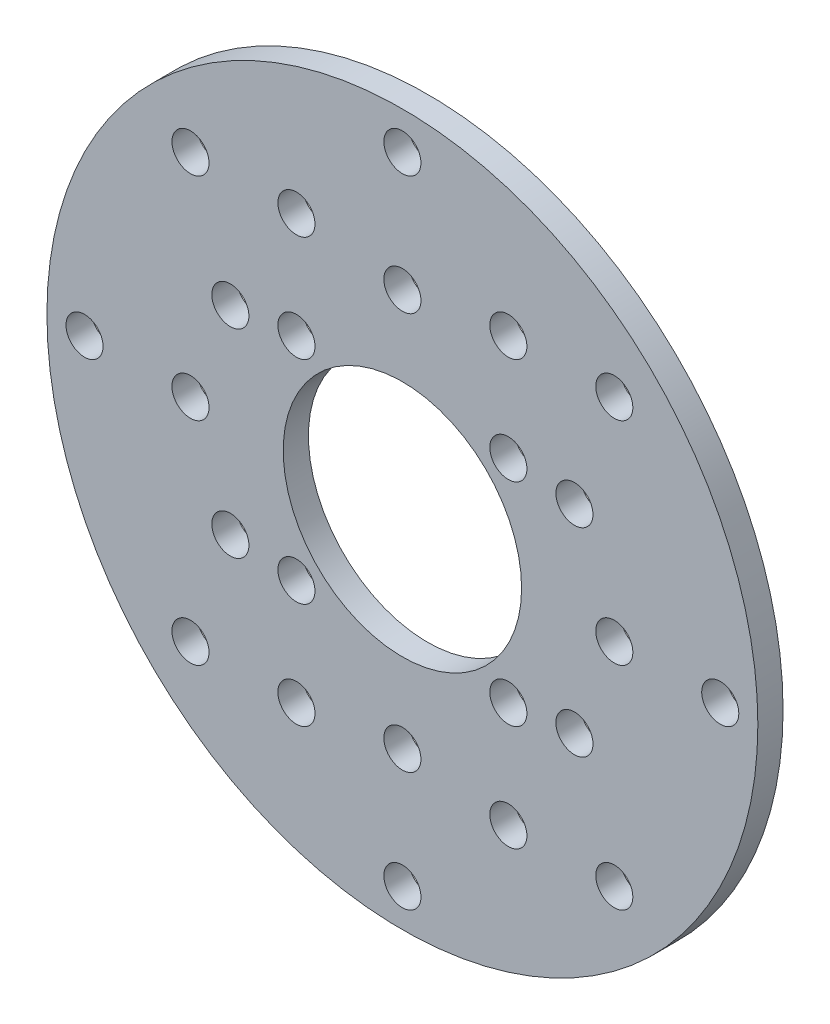
ISO-10303-21;
HEADER;
FILE_DESCRIPTION(('STEP AP214'),'2;1');
FILE_NAME('part.step','',(''),(''),'','','');
FILE_SCHEMA(('AUTOMOTIVE_DESIGN { 1 0 10303 214 1 1 1 1 }'));
ENDSEC;
DATA;
#1=APPLICATION_CONTEXT('core data for automotive mechanical design processes');
#2=APPLICATION_PROTOCOL_DEFINITION('international standard','automotive_design',2000,#1);
#3=PRODUCT_CONTEXT('',#1,'mechanical');
#4=PRODUCT('Part','Part','',(#3));
#5=PRODUCT_RELATED_PRODUCT_CATEGORY('part','',(#4));
#6=PRODUCT_DEFINITION_FORMATION('','',#4);
#7=PRODUCT_DEFINITION_CONTEXT('part definition',#1,'design');
#8=PRODUCT_DEFINITION('design','',#6,#7);
#9=PRODUCT_DEFINITION_SHAPE('','',#8);
#10=(LENGTH_UNIT() NAMED_UNIT(*) SI_UNIT(.MILLI.,.METRE.));
#11=(NAMED_UNIT(*) PLANE_ANGLE_UNIT() SI_UNIT($,.RADIAN.));
#12=(NAMED_UNIT(*) SI_UNIT($,.STERADIAN.) SOLID_ANGLE_UNIT());
#13=UNCERTAINTY_MEASURE_WITH_UNIT(LENGTH_MEASURE(1.E-05),#10,'distance_accuracy_value','');
#14=(GEOMETRIC_REPRESENTATION_CONTEXT(3) GLOBAL_UNCERTAINTY_ASSIGNED_CONTEXT((#13)) GLOBAL_UNIT_ASSIGNED_CONTEXT((#10,
#11,#12)) REPRESENTATION_CONTEXT('',''));
#15=CARTESIAN_POINT('',(0.,0.,0.));
#16=DIRECTION('',(0.,0.,1.));
#17=DIRECTION('',(1.,0.,0.));
#18=AXIS2_PLACEMENT_3D('',#15,#16,#17);
#19=CARTESIAN_POINT('',(0.,0.,-1.5113));
#20=DIRECTION('',(0.,0.,1.));
#21=DIRECTION('',(1.,0.,0.));
#22=AXIS2_PLACEMENT_3D('',#19,#20,#21);
#23=PLANE('',#22);
#24=CARTESIAN_POINT('',(-20.6222299276168,11.9062500000001,-1.5113));
#25=DIRECTION('',(0.,0.,-1.));
#26=DIRECTION('',(1.,0.,0.));
#27=AXIS2_PLACEMENT_3D('',#24,#25,#26);
#28=CIRCLE('',#27,2.2225);
#29=CARTESIAN_POINT('',(-18.3997299276168,11.9062500000001,-1.5113));
#30=VERTEX_POINT('',#29);
#31=EDGE_CURVE('E19',#30,#30,#28,.T.);
#32=ORIENTED_EDGE('',*,*,#31,.F.);
#33=EDGE_LOOP('',(#32));
#34=FACE_BOUND('',#33,.T.);
#35=CARTESIAN_POINT('',(1.69197988952874E-13,23.8125,-1.5113));
#36=DIRECTION('',(0.,0.,1.));
#37=DIRECTION('',(1.,0.,0.));
#38=AXIS2_PLACEMENT_3D('',#35,#36,#37);
#39=CIRCLE('',#38,2.22250000000016);
#40=CARTESIAN_POINT('',(2.22250000000033,23.8125,-1.5113));
#41=VERTEX_POINT('',#40);
#42=EDGE_CURVE('E187',#41,#41,#39,.T.);
#43=ORIENTED_EDGE('',*,*,#42,.T.);
#44=EDGE_LOOP('',(#43));
#45=FACE_BOUND('',#44,.T.);
#46=CARTESIAN_POINT('',(20.6222299276168,11.9062500000002,-1.5113));
#47=DIRECTION('',(0.,0.,1.));
#48=DIRECTION('',(1.,0.,0.));
#49=AXIS2_PLACEMENT_3D('',#46,#47,#48);
#50=CIRCLE('',#49,2.2225);
#51=CARTESIAN_POINT('',(22.8447299276168,11.9062500000002,-1.5113));
#52=VERTEX_POINT('',#51);
#53=EDGE_CURVE('E157',#52,#52,#50,.T.);
#54=ORIENTED_EDGE('',*,*,#53,.T.);
#55=EDGE_LOOP('',(#54));
#56=FACE_BOUND('',#55,.T.);
#57=CARTESIAN_POINT('',(0.,0.,-1.5113));
#58=DIRECTION('',(0.,0.,1.));
#59=DIRECTION('',(1.,0.,0.));
#60=AXIS2_PLACEMENT_3D('',#57,#58,#59);
#61=CIRCLE('',#60,14.2875);
#62=CARTESIAN_POINT('',(14.2875,0.,-1.5113));
#63=VERTEX_POINT('',#62);
#64=EDGE_CURVE('E156',#63,#63,#61,.T.);
#65=ORIENTED_EDGE('',*,*,#64,.T.);
#66=EDGE_LOOP('',(#65));
#67=FACE_BOUND('',#66,.T.);
#68=CARTESIAN_POINT('',(20.6222299276168,-11.9062500000001,-1.5113));
#69=DIRECTION('',(0.,0.,-1.));
#70=DIRECTION('',(1.,0.,0.));
#71=AXIS2_PLACEMENT_3D('',#68,#69,#70);
#72=CIRCLE('',#71,2.2225);
#73=CARTESIAN_POINT('',(22.8447299276169,-11.9062500000001,-1.5113));
#74=VERTEX_POINT('',#73);
#75=EDGE_CURVE('E158',#74,#74,#72,.T.);
#76=ORIENTED_EDGE('',*,*,#75,.F.);
#77=EDGE_LOOP('',(#76));
#78=FACE_BOUND('',#77,.T.);
#79=CARTESIAN_POINT('',(2.09313469334837E-13,-23.8125,-1.5113));
#80=DIRECTION('',(0.,0.,1.));
#81=DIRECTION('',(1.,0.,0.));
#82=AXIS2_PLACEMENT_3D('',#79,#80,#81);
#83=CIRCLE('',#82,2.2225);
#84=CARTESIAN_POINT('',(2.2225000000002,-23.8125,-1.5113));
#85=VERTEX_POINT('',#84);
#86=EDGE_CURVE('E226',#85,#85,#83,.T.);
#87=ORIENTED_EDGE('',*,*,#86,.T.);
#88=EDGE_LOOP('',(#87));
#89=FACE_BOUND('',#88,.T.);
#90=CARTESIAN_POINT('',(38.1,0.,-1.5113));
#91=DIRECTION('',(0.,0.,1.));
#92=DIRECTION('',(1.,0.,0.));
#93=AXIS2_PLACEMENT_3D('',#90,#91,#92);
#94=CIRCLE('',#93,2.2225);
#95=CARTESIAN_POINT('',(40.3225,0.,-1.5113));
#96=VERTEX_POINT('',#95);
#97=EDGE_CURVE('E180',#96,#96,#94,.T.);
#98=ORIENTED_EDGE('',*,*,#97,.T.);
#99=EDGE_LOOP('',(#98));
#100=FACE_BOUND('',#99,.T.);
#101=CARTESIAN_POINT('',(25.4,25.4,-1.5113));
#102=DIRECTION('',(0.,0.,1.));
#103=DIRECTION('',(1.,0.,0.));
#104=AXIS2_PLACEMENT_3D('',#101,#102,#103);
#105=CIRCLE('',#104,2.2225);
#106=CARTESIAN_POINT('',(27.6225,25.4,-1.5113));
#107=VERTEX_POINT('',#106);
#108=EDGE_CURVE('E179',#107,#107,#105,.T.);
#109=ORIENTED_EDGE('',*,*,#108,.T.);
#110=EDGE_LOOP('',(#109));
#111=FACE_BOUND('',#110,.T.);
#112=CARTESIAN_POINT('',(-25.4,0.,-1.5113));
#113=DIRECTION('',(0.,0.,1.));
#114=DIRECTION('',(1.,0.,0.));
#115=AXIS2_PLACEMENT_3D('',#112,#113,#114);
#116=CIRCLE('',#115,2.2225);
#117=CARTESIAN_POINT('',(-23.1775,0.,-1.5113));
#118=VERTEX_POINT('',#117);
#119=EDGE_CURVE('E174',#118,#118,#116,.T.);
#120=ORIENTED_EDGE('',*,*,#119,.T.);
#121=EDGE_LOOP('',(#120));
#122=FACE_BOUND('',#121,.T.);
#123=CARTESIAN_POINT('',(-38.1,-1.79105159992208E-13,-1.5113));
#124=DIRECTION('',(0.,0.,1.));
#125=DIRECTION('',(1.,0.,0.));
#126=AXIS2_PLACEMENT_3D('',#123,#124,#125);
#127=CIRCLE('',#126,2.2225);
#128=CARTESIAN_POINT('',(-35.8775,-1.79105159992208E-13,-1.5113));
#129=VERTEX_POINT('',#128);
#130=EDGE_CURVE('E173',#129,#129,#127,.T.);
#131=ORIENTED_EDGE('',*,*,#130,.T.);
#132=EDGE_LOOP('',(#131));
#133=FACE_BOUND('',#132,.T.);
#134=CARTESIAN_POINT('',(0.,38.1,-1.5113));
#135=DIRECTION('',(0.,0.,1.));
#136=DIRECTION('',(1.,0.,0.));
#137=AXIS2_PLACEMENT_3D('',#134,#135,#136);
#138=CIRCLE('',#137,2.2225);
#139=CARTESIAN_POINT('',(2.2225,38.1,-1.5113));
#140=VERTEX_POINT('',#139);
#141=EDGE_CURVE('E143',#140,#140,#138,.T.);
#142=ORIENTED_EDGE('',*,*,#141,.T.);
#143=EDGE_LOOP('',(#142));
#144=FACE_BOUND('',#143,.T.);
#145=CARTESIAN_POINT('',(-25.4,25.4,-1.5113));
#146=DIRECTION('',(0.,0.,1.));
#147=DIRECTION('',(1.,0.,0.));
#148=AXIS2_PLACEMENT_3D('',#145,#146,#147);
#149=CIRCLE('',#148,2.2225);
#150=CARTESIAN_POINT('',(-23.1775,25.4,-1.5113));
#151=VERTEX_POINT('',#150);
#152=EDGE_CURVE('E152',#151,#151,#149,.T.);
#153=ORIENTED_EDGE('',*,*,#152,.T.);
#154=EDGE_LOOP('',(#153));
#155=FACE_BOUND('',#154,.T.);
#156=CARTESIAN_POINT('',(12.7,12.7,-1.5113));
#157=DIRECTION('',(0.,0.,1.));
#158=DIRECTION('',(1.,0.,0.));
#159=AXIS2_PLACEMENT_3D('',#156,#157,#158);
#160=CIRCLE('',#159,2.2225);
#161=CARTESIAN_POINT('',(14.9225,12.7,-1.5113));
#162=VERTEX_POINT('',#161);
#163=EDGE_CURVE('E269',#162,#162,#160,.T.);
#164=ORIENTED_EDGE('',*,*,#163,.T.);
#165=EDGE_LOOP('',(#164));
#166=FACE_BOUND('',#165,.T.);
#167=CARTESIAN_POINT('',(12.7,25.4,-1.5113));
#168=DIRECTION('',(0.,0.,1.));
#169=DIRECTION('',(1.,0.,0.));
#170=AXIS2_PLACEMENT_3D('',#167,#168,#169);
#171=CIRCLE('',#170,2.2225);
#172=CARTESIAN_POINT('',(14.9225,25.4,-1.5113));
#173=VERTEX_POINT('',#172);
#174=EDGE_CURVE('E128',#173,#173,#171,.T.);
#175=ORIENTED_EDGE('',*,*,#174,.T.);
#176=EDGE_LOOP('',(#175));
#177=FACE_BOUND('',#176,.T.);
#178=CARTESIAN_POINT('',(25.4,-25.4,-1.5113));
#179=DIRECTION('',(0.,0.,1.));
#180=DIRECTION('',(1.,0.,0.));
#181=AXIS2_PLACEMENT_3D('',#178,#179,#180);
#182=CIRCLE('',#181,2.2225);
#183=CARTESIAN_POINT('',(27.6225,-25.4,-1.5113));
#184=VERTEX_POINT('',#183);
#185=EDGE_CURVE('E113',#184,#184,#182,.T.);
#186=ORIENTED_EDGE('',*,*,#185,.T.);
#187=EDGE_LOOP('',(#186));
#188=FACE_BOUND('',#187,.T.);
#189=CARTESIAN_POINT('',(-12.7,12.7,-1.5113));
#190=DIRECTION('',(0.,0.,1.));
#191=DIRECTION('',(1.,0.,0.));
#192=AXIS2_PLACEMENT_3D('',#189,#190,#191);
#193=CIRCLE('',#192,2.2225);
#194=CARTESIAN_POINT('',(-10.4775,12.7,-1.5113));
#195=VERTEX_POINT('',#194);
#196=EDGE_CURVE('E125',#195,#195,#193,.T.);
#197=ORIENTED_EDGE('',*,*,#196,.T.);
#198=EDGE_LOOP('',(#197));
#199=FACE_BOUND('',#198,.T.);
#200=CARTESIAN_POINT('',(-12.7,25.4,-1.5113));
#201=DIRECTION('',(0.,0.,1.));
#202=DIRECTION('',(1.,0.,0.));
#203=AXIS2_PLACEMENT_3D('',#200,#201,#202);
#204=CIRCLE('',#203,2.2225);
#205=CARTESIAN_POINT('',(-10.4775,25.4,-1.5113));
#206=VERTEX_POINT('',#205);
#207=EDGE_CURVE('E186',#206,#206,#204,.T.);
#208=ORIENTED_EDGE('',*,*,#207,.T.);
#209=EDGE_LOOP('',(#208));
#210=FACE_BOUND('',#209,.T.);
#211=CARTESIAN_POINT('',(12.7,-25.4,-1.5113));
#212=DIRECTION('',(0.,0.,1.));
#213=DIRECTION('',(1.,0.,0.));
#214=AXIS2_PLACEMENT_3D('',#211,#212,#213);
#215=CIRCLE('',#214,2.2225);
#216=CARTESIAN_POINT('',(14.9225,-25.4,-1.5113));
#217=VERTEX_POINT('',#216);
#218=EDGE_CURVE('E185',#217,#217,#215,.T.);
#219=ORIENTED_EDGE('',*,*,#218,.T.);
#220=EDGE_LOOP('',(#219));
#221=FACE_BOUND('',#220,.T.);
#222=CARTESIAN_POINT('',(12.7,-12.7,-1.5113));
#223=DIRECTION('',(0.,0.,1.));
#224=DIRECTION('',(1.,0.,0.));
#225=AXIS2_PLACEMENT_3D('',#222,#223,#224);
#226=CIRCLE('',#225,2.2225);
#227=CARTESIAN_POINT('',(14.9225,-12.7,-1.5113));
#228=VERTEX_POINT('',#227);
#229=EDGE_CURVE('E243',#228,#228,#226,.T.);
#230=ORIENTED_EDGE('',*,*,#229,.T.);
#231=EDGE_LOOP('',(#230));
#232=FACE_BOUND('',#231,.T.);
#233=CARTESIAN_POINT('',(25.4,0.,-1.5113));
#234=DIRECTION('',(0.,0.,1.));
#235=DIRECTION('',(1.,0.,0.));
#236=AXIS2_PLACEMENT_3D('',#233,#234,#235);
#237=CIRCLE('',#236,2.2225);
#238=CARTESIAN_POINT('',(27.6225,0.,-1.5113));
#239=VERTEX_POINT('',#238);
#240=EDGE_CURVE('E202',#239,#239,#237,.T.);
#241=ORIENTED_EDGE('',*,*,#240,.T.);
#242=EDGE_LOOP('',(#241));
#243=FACE_BOUND('',#242,.T.);
#244=CARTESIAN_POINT('',(0.,-38.1,-1.5113));
#245=DIRECTION('',(0.,0.,1.));
#246=DIRECTION('',(1.,0.,0.));
#247=AXIS2_PLACEMENT_3D('',#244,#245,#246);
#248=CIRCLE('',#247,2.2225);
#249=CARTESIAN_POINT('',(2.2225,-38.1,-1.5113));
#250=VERTEX_POINT('',#249);
#251=EDGE_CURVE('E138',#250,#250,#248,.T.);
#252=ORIENTED_EDGE('',*,*,#251,.T.);
#253=EDGE_LOOP('',(#252));
#254=FACE_BOUND('',#253,.T.);
#255=CARTESIAN_POINT('',(-12.7,-12.7,-1.5113));
#256=DIRECTION('',(0.,0.,1.));
#257=DIRECTION('',(1.,0.,0.));
#258=AXIS2_PLACEMENT_3D('',#255,#256,#257);
#259=CIRCLE('',#258,2.2225);
#260=CARTESIAN_POINT('',(-10.4775,-12.7,-1.5113));
#261=VERTEX_POINT('',#260);
#262=EDGE_CURVE('E137',#261,#261,#259,.T.);
#263=ORIENTED_EDGE('',*,*,#262,.T.);
#264=EDGE_LOOP('',(#263));
#265=FACE_BOUND('',#264,.T.);
#266=CARTESIAN_POINT('',(-12.7,-25.4,-1.5113));
#267=DIRECTION('',(0.,0.,1.));
#268=DIRECTION('',(1.,0.,0.));
#269=AXIS2_PLACEMENT_3D('',#266,#267,#268);
#270=CIRCLE('',#269,2.2225);
#271=CARTESIAN_POINT('',(-10.4775,-25.4,-1.5113));
#272=VERTEX_POINT('',#271);
#273=EDGE_CURVE('E249',#272,#272,#270,.T.);
#274=ORIENTED_EDGE('',*,*,#273,.T.);
#275=EDGE_LOOP('',(#274));
#276=FACE_BOUND('',#275,.T.);
#277=CARTESIAN_POINT('',(-25.4,-25.4,-1.5113));
#278=DIRECTION('',(0.,0.,1.));
#279=DIRECTION('',(1.,0.,0.));
#280=AXIS2_PLACEMENT_3D('',#277,#278,#279);
#281=CIRCLE('',#280,2.2225);
#282=CARTESIAN_POINT('',(-23.1775,-25.4,-1.5113));
#283=VERTEX_POINT('',#282);
#284=EDGE_CURVE('E254',#283,#283,#281,.T.);
#285=ORIENTED_EDGE('',*,*,#284,.T.);
#286=EDGE_LOOP('',(#285));
#287=FACE_BOUND('',#286,.T.);
#288=CARTESIAN_POINT('',(-20.6222299276168,-11.9062500000001,-1.5113));
#289=DIRECTION('',(0.,0.,1.));
#290=DIRECTION('',(1.,0.,0.));
#291=AXIS2_PLACEMENT_3D('',#288,#289,#290);
#292=CIRCLE('',#291,2.2225);
#293=CARTESIAN_POINT('',(-18.3997299276168,-11.9062500000001,-1.5113));
#294=VERTEX_POINT('',#293);
#295=EDGE_CURVE('E164',#294,#294,#292,.T.);
#296=ORIENTED_EDGE('',*,*,#295,.T.);
#297=EDGE_LOOP('',(#296));
#298=FACE_BOUND('',#297,.T.);
#299=CARTESIAN_POINT('',(0.,0.,-1.5113));
#300=DIRECTION('',(0.,0.,1.));
#301=DIRECTION('',(1.,0.,0.));
#302=AXIS2_PLACEMENT_3D('',#299,#300,#301);
#303=CIRCLE('',#302,42.6085);
#304=CARTESIAN_POINT('',(42.6085,0.,-1.5113));
#305=VERTEX_POINT('',#304);
#306=EDGE_CURVE('E207',#305,#305,#303,.T.);
#307=ORIENTED_EDGE('',*,*,#306,.F.);
#308=EDGE_LOOP('',(#307));
#309=FACE_BOUND('',#308,.T.);
#310=ADVANCED_FACE('F15',(#34,#45,#56,#67,#78,#89,#100,#111,#122,#133,#144,#155,#166,#177,#188,
#199,#210,#221,#232,#243,#254,#265,#276,#287,#298,#309),#23,.F.);
#311=CARTESIAN_POINT('',(0.,0.,1.5113));
#312=DIRECTION('',(0.,0.,1.));
#313=DIRECTION('',(1.,0.,0.));
#314=AXIS2_PLACEMENT_3D('',#311,#312,#313);
#315=PLANE('',#314);
#316=CARTESIAN_POINT('',(-20.6222299276168,11.9062500000001,1.5113));
#317=DIRECTION('',(0.,0.,-1.));
#318=DIRECTION('',(1.,0.,0.));
#319=AXIS2_PLACEMENT_3D('',#316,#317,#318);
#320=CIRCLE('',#319,2.2225);
#321=CARTESIAN_POINT('',(-18.3997299276168,11.9062500000001,1.5113));
#322=VERTEX_POINT('',#321);
#323=EDGE_CURVE('E10',#322,#322,#320,.T.);
#324=ORIENTED_EDGE('',*,*,#323,.T.);
#325=EDGE_LOOP('',(#324));
#326=FACE_BOUND('',#325,.T.);
#327=CARTESIAN_POINT('',(1.69197988952874E-13,23.8125,1.5113));
#328=DIRECTION('',(0.,0.,1.));
#329=DIRECTION('',(1.,0.,0.));
#330=AXIS2_PLACEMENT_3D('',#327,#328,#329);
#331=CIRCLE('',#330,2.22250000000016);
#332=CARTESIAN_POINT('',(2.22250000000033,23.8125,1.5113));
#333=VERTEX_POINT('',#332);
#334=EDGE_CURVE('E191',#333,#333,#331,.T.);
#335=ORIENTED_EDGE('',*,*,#334,.F.);
#336=EDGE_LOOP('',(#335));
#337=FACE_BOUND('',#336,.T.);
#338=CARTESIAN_POINT('',(20.6222299276168,11.9062500000002,1.5113));
#339=DIRECTION('',(0.,0.,1.));
#340=DIRECTION('',(1.,0.,0.));
#341=AXIS2_PLACEMENT_3D('',#338,#339,#340);
#342=CIRCLE('',#341,2.2225);
#343=CARTESIAN_POINT('',(22.8447299276168,11.9062500000002,1.5113));
#344=VERTEX_POINT('',#343);
#345=EDGE_CURVE('E153',#344,#344,#342,.T.);
#346=ORIENTED_EDGE('',*,*,#345,.F.);
#347=EDGE_LOOP('',(#346));
#348=FACE_BOUND('',#347,.T.);
#349=CARTESIAN_POINT('',(0.,0.,1.5113));
#350=DIRECTION('',(0.,0.,1.));
#351=DIRECTION('',(1.,0.,0.));
#352=AXIS2_PLACEMENT_3D('',#349,#350,#351);
#353=CIRCLE('',#352,14.2875);
#354=CARTESIAN_POINT('',(14.2875,0.,1.5113));
#355=VERTEX_POINT('',#354);
#356=EDGE_CURVE('E163',#355,#355,#353,.T.);
#357=ORIENTED_EDGE('',*,*,#356,.F.);
#358=EDGE_LOOP('',(#357));
#359=FACE_BOUND('',#358,.T.);
#360=CARTESIAN_POINT('',(20.6222299276168,-11.9062500000001,1.5113));
#361=DIRECTION('',(0.,0.,-1.));
#362=DIRECTION('',(1.,0.,0.));
#363=AXIS2_PLACEMENT_3D('',#360,#361,#362);
#364=CIRCLE('',#363,2.2225);
#365=CARTESIAN_POINT('',(22.8447299276169,-11.9062500000001,1.5113));
#366=VERTEX_POINT('',#365);
#367=EDGE_CURVE('E162',#366,#366,#364,.T.);
#368=ORIENTED_EDGE('',*,*,#367,.T.);
#369=EDGE_LOOP('',(#368));
#370=FACE_BOUND('',#369,.T.);
#371=CARTESIAN_POINT('',(2.09313469334837E-13,-23.8125,1.5113));
#372=DIRECTION('',(0.,0.,1.));
#373=DIRECTION('',(1.,0.,0.));
#374=AXIS2_PLACEMENT_3D('',#371,#372,#373);
#375=CIRCLE('',#374,2.2225);
#376=CARTESIAN_POINT('',(2.2225000000002,-23.8125,1.5113));
#377=VERTEX_POINT('',#376);
#378=EDGE_CURVE('E219',#377,#377,#375,.T.);
#379=ORIENTED_EDGE('',*,*,#378,.F.);
#380=EDGE_LOOP('',(#379));
#381=FACE_BOUND('',#380,.T.);
#382=CARTESIAN_POINT('',(38.1,0.,1.5113));
#383=DIRECTION('',(0.,0.,1.));
#384=DIRECTION('',(1.,0.,0.));
#385=AXIS2_PLACEMENT_3D('',#382,#383,#384);
#386=CIRCLE('',#385,2.2225);
#387=CARTESIAN_POINT('',(40.3225,0.,1.5113));
#388=VERTEX_POINT('',#387);
#389=EDGE_CURVE('E175',#388,#388,#386,.T.);
#390=ORIENTED_EDGE('',*,*,#389,.F.);
#391=EDGE_LOOP('',(#390));
#392=FACE_BOUND('',#391,.T.);
#393=CARTESIAN_POINT('',(25.4,25.4,1.5113));
#394=DIRECTION('',(0.,0.,1.));
#395=DIRECTION('',(1.,0.,0.));
#396=AXIS2_PLACEMENT_3D('',#393,#394,#395);
#397=CIRCLE('',#396,2.2225);
#398=CARTESIAN_POINT('',(27.6225,25.4,1.5113));
#399=VERTEX_POINT('',#398);
#400=EDGE_CURVE('E132',#399,#399,#397,.T.);
#401=ORIENTED_EDGE('',*,*,#400,.F.);
#402=EDGE_LOOP('',(#401));
#403=FACE_BOUND('',#402,.T.);
#404=CARTESIAN_POINT('',(-25.4,0.,1.5113));
#405=DIRECTION('',(0.,0.,1.));
#406=DIRECTION('',(1.,0.,0.));
#407=AXIS2_PLACEMENT_3D('',#404,#405,#406);
#408=CIRCLE('',#407,2.2225);
#409=CARTESIAN_POINT('',(-23.1775,0.,1.5113));
#410=VERTEX_POINT('',#409);
#411=EDGE_CURVE('E169',#410,#410,#408,.T.);
#412=ORIENTED_EDGE('',*,*,#411,.F.);
#413=EDGE_LOOP('',(#412));
#414=FACE_BOUND('',#413,.T.);
#415=CARTESIAN_POINT('',(-38.1,-1.79105159992208E-13,1.5113));
#416=DIRECTION('',(0.,0.,1.));
#417=DIRECTION('',(1.,0.,0.));
#418=AXIS2_PLACEMENT_3D('',#415,#416,#417);
#419=CIRCLE('',#418,2.2225);
#420=CARTESIAN_POINT('',(-35.8775,-1.79105159992208E-13,1.5113));
#421=VERTEX_POINT('',#420);
#422=EDGE_CURVE('E148',#421,#421,#419,.T.);
#423=ORIENTED_EDGE('',*,*,#422,.F.);
#424=EDGE_LOOP('',(#423));
#425=FACE_BOUND('',#424,.T.);
#426=CARTESIAN_POINT('',(0.,38.1,1.5113));
#427=DIRECTION('',(0.,0.,1.));
#428=DIRECTION('',(1.,0.,0.));
#429=AXIS2_PLACEMENT_3D('',#426,#427,#428);
#430=CIRCLE('',#429,2.2225);
#431=CARTESIAN_POINT('',(2.2225,38.1,1.5113));
#432=VERTEX_POINT('',#431);
#433=EDGE_CURVE('E147',#432,#432,#430,.T.);
#434=ORIENTED_EDGE('',*,*,#433,.F.);
#435=EDGE_LOOP('',(#434));
#436=FACE_BOUND('',#435,.T.);
#437=CARTESIAN_POINT('',(-25.4,25.4,1.5113));
#438=DIRECTION('',(0.,0.,1.));
#439=DIRECTION('',(1.,0.,0.));
#440=AXIS2_PLACEMENT_3D('',#437,#438,#439);
#441=CIRCLE('',#440,2.2225);
#442=CARTESIAN_POINT('',(-23.1775,25.4,1.5113));
#443=VERTEX_POINT('',#442);
#444=EDGE_CURVE('E206',#443,#443,#441,.T.);
#445=ORIENTED_EDGE('',*,*,#444,.F.);
#446=EDGE_LOOP('',(#445));
#447=FACE_BOUND('',#446,.T.);
#448=CARTESIAN_POINT('',(12.7,12.7,1.5113));
#449=DIRECTION('',(0.,0.,1.));
#450=DIRECTION('',(1.,0.,0.));
#451=AXIS2_PLACEMENT_3D('',#448,#449,#450);
#452=CIRCLE('',#451,2.2225);
#453=CARTESIAN_POINT('',(14.9225,12.7,1.5113));
#454=VERTEX_POINT('',#453);
#455=EDGE_CURVE('E142',#454,#454,#452,.T.);
#456=ORIENTED_EDGE('',*,*,#455,.F.);
#457=EDGE_LOOP('',(#456));
#458=FACE_BOUND('',#457,.T.);
#459=CARTESIAN_POINT('',(12.7,25.4,1.5113));
#460=DIRECTION('',(0.,0.,1.));
#461=DIRECTION('',(1.,0.,0.));
#462=AXIS2_PLACEMENT_3D('',#459,#460,#461);
#463=CIRCLE('',#462,2.2225);
#464=CARTESIAN_POINT('',(14.9225,25.4,1.5113));
#465=VERTEX_POINT('',#464);
#466=EDGE_CURVE('E118',#465,#465,#463,.T.);
#467=ORIENTED_EDGE('',*,*,#466,.F.);
#468=EDGE_LOOP('',(#467));
#469=FACE_BOUND('',#468,.T.);
#470=CARTESIAN_POINT('',(25.4,-25.4,1.5113));
#471=DIRECTION('',(0.,0.,1.));
#472=DIRECTION('',(1.,0.,0.));
#473=AXIS2_PLACEMENT_3D('',#470,#471,#472);
#474=CIRCLE('',#473,2.2225);
#475=CARTESIAN_POINT('',(27.6225,-25.4,1.5113));
#476=VERTEX_POINT('',#475);
#477=EDGE_CURVE('E117',#476,#476,#474,.T.);
#478=ORIENTED_EDGE('',*,*,#477,.F.);
#479=EDGE_LOOP('',(#478));
#480=FACE_BOUND('',#479,.T.);
#481=CARTESIAN_POINT('',(-12.7,12.7,1.5113));
#482=DIRECTION('',(0.,0.,1.));
#483=DIRECTION('',(1.,0.,0.));
#484=AXIS2_PLACEMENT_3D('',#481,#482,#483);
#485=CIRCLE('',#484,2.2225);
#486=CARTESIAN_POINT('',(-10.4775,12.7,1.5113));
#487=VERTEX_POINT('',#486);
#488=EDGE_CURVE('E195',#487,#487,#485,.T.);
#489=ORIENTED_EDGE('',*,*,#488,.F.);
#490=EDGE_LOOP('',(#489));
#491=FACE_BOUND('',#490,.T.);
#492=CARTESIAN_POINT('',(-12.7,25.4,1.5113));
#493=DIRECTION('',(0.,0.,1.));
#494=DIRECTION('',(1.,0.,0.));
#495=AXIS2_PLACEMENT_3D('',#492,#493,#494);
#496=CIRCLE('',#495,2.2225);
#497=CARTESIAN_POINT('',(-10.4775,25.4,1.5113));
#498=VERTEX_POINT('',#497);
#499=EDGE_CURVE('E181',#498,#498,#496,.T.);
#500=ORIENTED_EDGE('',*,*,#499,.F.);
#501=EDGE_LOOP('',(#500));
#502=FACE_BOUND('',#501,.T.);
#503=CARTESIAN_POINT('',(12.7,-25.4,1.5113));
#504=DIRECTION('',(0.,0.,1.));
#505=DIRECTION('',(1.,0.,0.));
#506=AXIS2_PLACEMENT_3D('',#503,#504,#505);
#507=CIRCLE('',#506,2.2225);
#508=CARTESIAN_POINT('',(14.9225,-25.4,1.5113));
#509=VERTEX_POINT('',#508);
#510=EDGE_CURVE('E275',#509,#509,#507,.T.);
#511=ORIENTED_EDGE('',*,*,#510,.F.);
#512=EDGE_LOOP('',(#511));
#513=FACE_BOUND('',#512,.T.);
#514=CARTESIAN_POINT('',(12.7,-12.7,1.5113));
#515=DIRECTION('',(0.,0.,1.));
#516=DIRECTION('',(1.,0.,0.));
#517=AXIS2_PLACEMENT_3D('',#514,#515,#516);
#518=CIRCLE('',#517,2.2225);
#519=CARTESIAN_POINT('',(14.9225,-12.7,1.5113));
#520=VERTEX_POINT('',#519);
#521=EDGE_CURVE('E240',#520,#520,#518,.T.);
#522=ORIENTED_EDGE('',*,*,#521,.F.);
#523=EDGE_LOOP('',(#522));
#524=FACE_BOUND('',#523,.T.);
#525=CARTESIAN_POINT('',(25.4,0.,1.5113));
#526=DIRECTION('',(0.,0.,1.));
#527=DIRECTION('',(1.,0.,0.));
#528=AXIS2_PLACEMENT_3D('',#525,#526,#527);
#529=CIRCLE('',#528,2.2225);
#530=CARTESIAN_POINT('',(27.6225,0.,1.5113));
#531=VERTEX_POINT('',#530);
#532=EDGE_CURVE('E198',#531,#531,#529,.T.);
#533=ORIENTED_EDGE('',*,*,#532,.F.);
#534=EDGE_LOOP('',(#533));
#535=FACE_BOUND('',#534,.T.);
#536=CARTESIAN_POINT('',(0.,-38.1,1.5113));
#537=DIRECTION('',(0.,0.,1.));
#538=DIRECTION('',(1.,0.,0.));
#539=AXIS2_PLACEMENT_3D('',#536,#537,#538);
#540=CIRCLE('',#539,2.2225);
#541=CARTESIAN_POINT('',(2.2225,-38.1,1.5113));
#542=VERTEX_POINT('',#541);
#543=EDGE_CURVE('E134',#542,#542,#540,.T.);
#544=ORIENTED_EDGE('',*,*,#543,.F.);
#545=EDGE_LOOP('',(#544));
#546=FACE_BOUND('',#545,.T.);
#547=CARTESIAN_POINT('',(-12.7,-12.7,1.5113));
#548=DIRECTION('',(0.,0.,1.));
#549=DIRECTION('',(1.,0.,0.));
#550=AXIS2_PLACEMENT_3D('',#547,#548,#549);
#551=CIRCLE('',#550,2.2225);
#552=CARTESIAN_POINT('',(-10.4775,-12.7,1.5113));
#553=VERTEX_POINT('',#552);
#554=EDGE_CURVE('E216',#553,#553,#551,.T.);
#555=ORIENTED_EDGE('',*,*,#554,.F.);
#556=EDGE_LOOP('',(#555));
#557=FACE_BOUND('',#556,.T.);
#558=CARTESIAN_POINT('',(-12.7,-25.4,1.5113));
#559=DIRECTION('',(0.,0.,1.));
#560=DIRECTION('',(1.,0.,0.));
#561=AXIS2_PLACEMENT_3D('',#558,#559,#560);
#562=CIRCLE('',#561,2.2225);
#563=CARTESIAN_POINT('',(-10.4775,-25.4,1.5113));
#564=VERTEX_POINT('',#563);
#565=EDGE_CURVE('E253',#564,#564,#562,.T.);
#566=ORIENTED_EDGE('',*,*,#565,.F.);
#567=EDGE_LOOP('',(#566));
#568=FACE_BOUND('',#567,.T.);
#569=CARTESIAN_POINT('',(-25.4,-25.4,1.5113));
#570=DIRECTION('',(0.,0.,1.));
#571=DIRECTION('',(1.,0.,0.));
#572=AXIS2_PLACEMENT_3D('',#569,#570,#571);
#573=CIRCLE('',#572,2.2225);
#574=CARTESIAN_POINT('',(-23.1775,-25.4,1.5113));
#575=VERTEX_POINT('',#574);
#576=EDGE_CURVE('E168',#575,#575,#573,.T.);
#577=ORIENTED_EDGE('',*,*,#576,.F.);
#578=EDGE_LOOP('',(#577));
#579=FACE_BOUND('',#578,.T.);
#580=CARTESIAN_POINT('',(-20.6222299276168,-11.9062500000001,1.5113));
#581=DIRECTION('',(0.,0.,1.));
#582=DIRECTION('',(1.,0.,0.));
#583=AXIS2_PLACEMENT_3D('',#580,#581,#582);
#584=CIRCLE('',#583,2.2225);
#585=CARTESIAN_POINT('',(-18.3997299276168,-11.9062500000001,1.5113));
#586=VERTEX_POINT('',#585);
#587=EDGE_CURVE('E167',#586,#586,#584,.T.);
#588=ORIENTED_EDGE('',*,*,#587,.F.);
#589=EDGE_LOOP('',(#588));
#590=FACE_BOUND('',#589,.T.);
#591=CARTESIAN_POINT('',(0.,0.,1.5113));
#592=DIRECTION('',(0.,0.,1.));
#593=DIRECTION('',(1.,0.,0.));
#594=AXIS2_PLACEMENT_3D('',#591,#592,#593);
#595=CIRCLE('',#594,42.6085);
#596=CARTESIAN_POINT('',(42.6085,0.,1.5113));
#597=VERTEX_POINT('',#596);
#598=EDGE_CURVE('E211',#597,#597,#595,.T.);
#599=ORIENTED_EDGE('',*,*,#598,.T.);
#600=EDGE_LOOP('',(#599));
#601=FACE_BOUND('',#600,.T.);
#602=ADVANCED_FACE('F328',(#326,#337,#348,#359,#370,#381,#392,#403,#414,#425,#436,#447,#458,
#469,#480,#491,#502,#513,#524,#535,#546,#557,#568,#579,#590,#601),#315,.T.);
#603=CARTESIAN_POINT('',(-20.6222299276168,11.9062500000001,1.5113));
#604=DIRECTION('',(0.,0.,-1.));
#605=DIRECTION('',(-1.,0.,0.));
#606=AXIS2_PLACEMENT_3D('',#603,#604,#605);
#607=CYLINDRICAL_SURFACE('',#606,2.2225);
#608=ORIENTED_EDGE('',*,*,#323,.F.);
#609=EDGE_LOOP('',(#608));
#610=FACE_BOUND('',#609,.T.);
#611=ORIENTED_EDGE('',*,*,#31,.T.);
#612=EDGE_LOOP('',(#611));
#613=FACE_BOUND('',#612,.T.);
#614=ADVANCED_FACE('F331',(#610,#613),#607,.F.);
#615=CARTESIAN_POINT('',(0.,0.,1.5113));
#616=DIRECTION('',(0.,0.,-1.));
#617=DIRECTION('',(-1.,0.,0.));
#618=AXIS2_PLACEMENT_3D('',#615,#616,#617);
#619=CYLINDRICAL_SURFACE('',#618,42.6085);
#620=ORIENTED_EDGE('',*,*,#598,.F.);
#621=EDGE_LOOP('',(#620));
#622=FACE_BOUND('',#621,.T.);
#623=ORIENTED_EDGE('',*,*,#306,.T.);
#624=EDGE_LOOP('',(#623));
#625=FACE_BOUND('',#624,.T.);
#626=ADVANCED_FACE('F365',(#622,#625),#619,.T.);
#627=CARTESIAN_POINT('',(-20.6222299276168,-11.9062500000001,1.5113));
#628=DIRECTION('',(0.,0.,-1.));
#629=DIRECTION('',(-1.,0.,0.));
#630=AXIS2_PLACEMENT_3D('',#627,#628,#629);
#631=CYLINDRICAL_SURFACE('',#630,2.2225);
#632=ORIENTED_EDGE('',*,*,#587,.T.);
#633=EDGE_LOOP('',(#632));
#634=FACE_BOUND('',#633,.T.);
#635=ORIENTED_EDGE('',*,*,#295,.F.);
#636=EDGE_LOOP('',(#635));
#637=FACE_BOUND('',#636,.T.);
#638=ADVANCED_FACE('F368',(#634,#637),#631,.F.);
#639=CARTESIAN_POINT('',(-25.4,-25.4,1.5113));
#640=DIRECTION('',(0.,0.,-1.));
#641=DIRECTION('',(-1.,0.,0.));
#642=AXIS2_PLACEMENT_3D('',#639,#640,#641);
#643=CYLINDRICAL_SURFACE('',#642,2.2225);
#644=ORIENTED_EDGE('',*,*,#576,.T.);
#645=EDGE_LOOP('',(#644));
#646=FACE_BOUND('',#645,.T.);
#647=ORIENTED_EDGE('',*,*,#284,.F.);
#648=EDGE_LOOP('',(#647));
#649=FACE_BOUND('',#648,.T.);
#650=ADVANCED_FACE('F400',(#646,#649),#643,.F.);
#651=CARTESIAN_POINT('',(-12.7,-25.4,1.5113));
#652=DIRECTION('',(0.,0.,-1.));
#653=DIRECTION('',(-1.,0.,0.));
#654=AXIS2_PLACEMENT_3D('',#651,#652,#653);
#655=CYLINDRICAL_SURFACE('',#654,2.2225);
#656=ORIENTED_EDGE('',*,*,#565,.T.);
#657=EDGE_LOOP('',(#656));
#658=FACE_BOUND('',#657,.T.);
#659=ORIENTED_EDGE('',*,*,#273,.F.);
#660=EDGE_LOOP('',(#659));
#661=FACE_BOUND('',#660,.T.);
#662=ADVANCED_FACE('F396',(#658,#661),#655,.F.);
#663=CARTESIAN_POINT('',(-12.7,-12.7,1.5113));
#664=DIRECTION('',(0.,0.,-1.));
#665=DIRECTION('',(-1.,0.,0.));
#666=AXIS2_PLACEMENT_3D('',#663,#664,#665);
#667=CYLINDRICAL_SURFACE('',#666,2.2225);
#668=ORIENTED_EDGE('',*,*,#554,.T.);
#669=EDGE_LOOP('',(#668));
#670=FACE_BOUND('',#669,.T.);
#671=ORIENTED_EDGE('',*,*,#262,.F.);
#672=EDGE_LOOP('',(#671));
#673=FACE_BOUND('',#672,.T.);
#674=ADVANCED_FACE('F393',(#670,#673),#667,.F.);
#675=CARTESIAN_POINT('',(0.,-38.1,1.5113));
#676=DIRECTION('',(0.,0.,-1.));
#677=DIRECTION('',(-1.,0.,0.));
#678=AXIS2_PLACEMENT_3D('',#675,#676,#677);
#679=CYLINDRICAL_SURFACE('',#678,2.2225);
#680=ORIENTED_EDGE('',*,*,#543,.T.);
#681=EDGE_LOOP('',(#680));
#682=FACE_BOUND('',#681,.T.);
#683=ORIENTED_EDGE('',*,*,#251,.F.);
#684=EDGE_LOOP('',(#683));
#685=FACE_BOUND('',#684,.T.);
#686=ADVANCED_FACE('F384',(#682,#685),#679,.F.);
#687=CARTESIAN_POINT('',(25.4,0.,1.5113));
#688=DIRECTION('',(0.,0.,-1.));
#689=DIRECTION('',(-1.,0.,0.));
#690=AXIS2_PLACEMENT_3D('',#687,#688,#689);
#691=CYLINDRICAL_SURFACE('',#690,2.2225);
#692=ORIENTED_EDGE('',*,*,#532,.T.);
#693=EDGE_LOOP('',(#692));
#694=FACE_BOUND('',#693,.T.);
#695=ORIENTED_EDGE('',*,*,#240,.F.);
#696=EDGE_LOOP('',(#695));
#697=FACE_BOUND('',#696,.T.);
#698=ADVANCED_FACE('F454',(#694,#697),#691,.F.);
#699=CARTESIAN_POINT('',(12.7,-12.7,1.5113));
#700=DIRECTION('',(0.,0.,-1.));
#701=DIRECTION('',(-1.,0.,0.));
#702=AXIS2_PLACEMENT_3D('',#699,#700,#701);
#703=CYLINDRICAL_SURFACE('',#702,2.2225);
#704=ORIENTED_EDGE('',*,*,#521,.T.);
#705=EDGE_LOOP('',(#704));
#706=FACE_BOUND('',#705,.T.);
#707=ORIENTED_EDGE('',*,*,#229,.F.);
#708=EDGE_LOOP('',(#707));
#709=FACE_BOUND('',#708,.T.);
#710=ADVANCED_FACE('F452',(#706,#709),#703,.F.);
#711=CARTESIAN_POINT('',(12.7,-25.4,1.5113));
#712=DIRECTION('',(0.,0.,-1.));
#713=DIRECTION('',(-1.,0.,0.));
#714=AXIS2_PLACEMENT_3D('',#711,#712,#713);
#715=CYLINDRICAL_SURFACE('',#714,2.2225);
#716=ORIENTED_EDGE('',*,*,#510,.T.);
#717=EDGE_LOOP('',(#716));
#718=FACE_BOUND('',#717,.T.);
#719=ORIENTED_EDGE('',*,*,#218,.F.);
#720=EDGE_LOOP('',(#719));
#721=FACE_BOUND('',#720,.T.);
#722=ADVANCED_FACE('F450',(#718,#721),#715,.F.);
#723=CARTESIAN_POINT('',(-12.7,25.4,1.5113));
#724=DIRECTION('',(0.,0.,-1.));
#725=DIRECTION('',(-1.,0.,0.));
#726=AXIS2_PLACEMENT_3D('',#723,#724,#725);
#727=CYLINDRICAL_SURFACE('',#726,2.2225);
#728=ORIENTED_EDGE('',*,*,#499,.T.);
#729=EDGE_LOOP('',(#728));
#730=FACE_BOUND('',#729,.T.);
#731=ORIENTED_EDGE('',*,*,#207,.F.);
#732=EDGE_LOOP('',(#731));
#733=FACE_BOUND('',#732,.T.);
#734=ADVANCED_FACE('F444',(#730,#733),#727,.F.);
#735=CARTESIAN_POINT('',(-12.7,12.7,1.5113));
#736=DIRECTION('',(0.,0.,-1.));
#737=DIRECTION('',(-1.,0.,0.));
#738=AXIS2_PLACEMENT_3D('',#735,#736,#737);
#739=CYLINDRICAL_SURFACE('',#738,2.2225);
#740=ORIENTED_EDGE('',*,*,#488,.T.);
#741=EDGE_LOOP('',(#740));
#742=FACE_BOUND('',#741,.T.);
#743=ORIENTED_EDGE('',*,*,#196,.F.);
#744=EDGE_LOOP('',(#743));
#745=FACE_BOUND('',#744,.T.);
#746=ADVANCED_FACE('F431',(#742,#745),#739,.F.);
#747=CARTESIAN_POINT('',(25.4,-25.4,1.5113));
#748=DIRECTION('',(0.,0.,-1.));
#749=DIRECTION('',(-1.,0.,0.));
#750=AXIS2_PLACEMENT_3D('',#747,#748,#749);
#751=CYLINDRICAL_SURFACE('',#750,2.2225);
#752=ORIENTED_EDGE('',*,*,#477,.T.);
#753=EDGE_LOOP('',(#752));
#754=FACE_BOUND('',#753,.T.);
#755=ORIENTED_EDGE('',*,*,#185,.F.);
#756=EDGE_LOOP('',(#755));
#757=FACE_BOUND('',#756,.T.);
#758=ADVANCED_FACE('F424',(#754,#757),#751,.F.);
#759=CARTESIAN_POINT('',(12.7,25.4,1.5113));
#760=DIRECTION('',(0.,0.,-1.));
#761=DIRECTION('',(-1.,0.,0.));
#762=AXIS2_PLACEMENT_3D('',#759,#760,#761);
#763=CYLINDRICAL_SURFACE('',#762,2.2225);
#764=ORIENTED_EDGE('',*,*,#466,.T.);
#765=EDGE_LOOP('',(#764));
#766=FACE_BOUND('',#765,.T.);
#767=ORIENTED_EDGE('',*,*,#174,.F.);
#768=EDGE_LOOP('',(#767));
#769=FACE_BOUND('',#768,.T.);
#770=ADVANCED_FACE('F404',(#766,#769),#763,.F.);
#771=CARTESIAN_POINT('',(12.7,12.7,1.5113));
#772=DIRECTION('',(0.,0.,-1.));
#773=DIRECTION('',(-1.,0.,0.));
#774=AXIS2_PLACEMENT_3D('',#771,#772,#773);
#775=CYLINDRICAL_SURFACE('',#774,2.2225);
#776=ORIENTED_EDGE('',*,*,#455,.T.);
#777=EDGE_LOOP('',(#776));
#778=FACE_BOUND('',#777,.T.);
#779=ORIENTED_EDGE('',*,*,#163,.F.);
#780=EDGE_LOOP('',(#779));
#781=FACE_BOUND('',#780,.T.);
#782=ADVANCED_FACE('F389',(#778,#781),#775,.F.);
#783=CARTESIAN_POINT('',(-25.4,25.4,1.5113));
#784=DIRECTION('',(0.,0.,-1.));
#785=DIRECTION('',(-1.,0.,0.));
#786=AXIS2_PLACEMENT_3D('',#783,#784,#785);
#787=CYLINDRICAL_SURFACE('',#786,2.2225);
#788=ORIENTED_EDGE('',*,*,#444,.T.);
#789=EDGE_LOOP('',(#788));
#790=FACE_BOUND('',#789,.T.);
#791=ORIENTED_EDGE('',*,*,#152,.F.);
#792=EDGE_LOOP('',(#791));
#793=FACE_BOUND('',#792,.T.);
#794=ADVANCED_FACE('F325',(#790,#793),#787,.F.);
#795=CARTESIAN_POINT('',(0.,38.1,1.5113));
#796=DIRECTION('',(0.,0.,-1.));
#797=DIRECTION('',(-1.,0.,0.));
#798=AXIS2_PLACEMENT_3D('',#795,#796,#797);
#799=CYLINDRICAL_SURFACE('',#798,2.2225);
#800=ORIENTED_EDGE('',*,*,#433,.T.);
#801=EDGE_LOOP('',(#800));
#802=FACE_BOUND('',#801,.T.);
#803=ORIENTED_EDGE('',*,*,#141,.F.);
#804=EDGE_LOOP('',(#803));
#805=FACE_BOUND('',#804,.T.);
#806=ADVANCED_FACE('F388',(#802,#805),#799,.F.);
#807=CARTESIAN_POINT('',(-38.1,-1.79105159992208E-13,1.5113));
#808=DIRECTION('',(0.,0.,-1.));
#809=DIRECTION('',(-1.,0.,0.));
#810=AXIS2_PLACEMENT_3D('',#807,#808,#809);
#811=CYLINDRICAL_SURFACE('',#810,2.2225);
#812=ORIENTED_EDGE('',*,*,#422,.T.);
#813=EDGE_LOOP('',(#812));
#814=FACE_BOUND('',#813,.T.);
#815=ORIENTED_EDGE('',*,*,#130,.F.);
#816=EDGE_LOOP('',(#815));
#817=FACE_BOUND('',#816,.T.);
#818=ADVANCED_FACE('F415',(#814,#817),#811,.F.);
#819=CARTESIAN_POINT('',(-25.4,0.,1.5113));
#820=DIRECTION('',(0.,0.,-1.));
#821=DIRECTION('',(-1.,0.,0.));
#822=AXIS2_PLACEMENT_3D('',#819,#820,#821);
#823=CYLINDRICAL_SURFACE('',#822,2.2225);
#824=ORIENTED_EDGE('',*,*,#411,.T.);
#825=EDGE_LOOP('',(#824));
#826=FACE_BOUND('',#825,.T.);
#827=ORIENTED_EDGE('',*,*,#119,.F.);
#828=EDGE_LOOP('',(#827));
#829=FACE_BOUND('',#828,.T.);
#830=ADVANCED_FACE('F411',(#826,#829),#823,.F.);
#831=CARTESIAN_POINT('',(25.4,25.4,1.5113));
#832=DIRECTION('',(0.,0.,-1.));
#833=DIRECTION('',(-1.,0.,0.));
#834=AXIS2_PLACEMENT_3D('',#831,#832,#833);
#835=CYLINDRICAL_SURFACE('',#834,2.2225);
#836=ORIENTED_EDGE('',*,*,#400,.T.);
#837=EDGE_LOOP('',(#836));
#838=FACE_BOUND('',#837,.T.);
#839=ORIENTED_EDGE('',*,*,#108,.F.);
#840=EDGE_LOOP('',(#839));
#841=FACE_BOUND('',#840,.T.);
#842=ADVANCED_FACE('F414',(#838,#841),#835,.F.);
#843=CARTESIAN_POINT('',(38.1,0.,1.5113));
#844=DIRECTION('',(0.,0.,-1.));
#845=DIRECTION('',(-1.,0.,0.));
#846=AXIS2_PLACEMENT_3D('',#843,#844,#845);
#847=CYLINDRICAL_SURFACE('',#846,2.2225);
#848=ORIENTED_EDGE('',*,*,#389,.T.);
#849=EDGE_LOOP('',(#848));
#850=FACE_BOUND('',#849,.T.);
#851=ORIENTED_EDGE('',*,*,#97,.F.);
#852=EDGE_LOOP('',(#851));
#853=FACE_BOUND('',#852,.T.);
#854=ADVANCED_FACE('F421',(#850,#853),#847,.F.);
#855=CARTESIAN_POINT('',(2.09313469334837E-13,-23.8125,1.5113));
#856=DIRECTION('',(0.,0.,-1.));
#857=DIRECTION('',(-1.,0.,0.));
#858=AXIS2_PLACEMENT_3D('',#855,#856,#857);
#859=CYLINDRICAL_SURFACE('',#858,2.2225);
#860=ORIENTED_EDGE('',*,*,#378,.T.);
#861=EDGE_LOOP('',(#860));
#862=FACE_BOUND('',#861,.T.);
#863=ORIENTED_EDGE('',*,*,#86,.F.);
#864=EDGE_LOOP('',(#863));
#865=FACE_BOUND('',#864,.T.);
#866=ADVANCED_FACE('F417',(#862,#865),#859,.F.);
#867=CARTESIAN_POINT('',(20.6222299276168,-11.9062500000001,1.5113));
#868=DIRECTION('',(0.,0.,-1.));
#869=DIRECTION('',(-1.,0.,0.));
#870=AXIS2_PLACEMENT_3D('',#867,#868,#869);
#871=CYLINDRICAL_SURFACE('',#870,2.2225);
#872=ORIENTED_EDGE('',*,*,#367,.F.);
#873=EDGE_LOOP('',(#872));
#874=FACE_BOUND('',#873,.T.);
#875=ORIENTED_EDGE('',*,*,#75,.T.);
#876=EDGE_LOOP('',(#875));
#877=FACE_BOUND('',#876,.T.);
#878=ADVANCED_FACE('F420',(#874,#877),#871,.F.);
#879=CARTESIAN_POINT('',(0.,0.,1.5113));
#880=DIRECTION('',(0.,0.,-1.));
#881=DIRECTION('',(-1.,0.,0.));
#882=AXIS2_PLACEMENT_3D('',#879,#880,#881);
#883=CYLINDRICAL_SURFACE('',#882,14.2875);
#884=ORIENTED_EDGE('',*,*,#356,.T.);
#885=EDGE_LOOP('',(#884));
#886=FACE_BOUND('',#885,.T.);
#887=ORIENTED_EDGE('',*,*,#64,.F.);
#888=EDGE_LOOP('',(#887));
#889=FACE_BOUND('',#888,.T.);
#890=ADVANCED_FACE('F409',(#886,#889),#883,.F.);
#891=CARTESIAN_POINT('',(20.6222299276168,11.9062500000002,1.5113));
#892=DIRECTION('',(0.,0.,-1.));
#893=DIRECTION('',(-1.,0.,0.));
#894=AXIS2_PLACEMENT_3D('',#891,#892,#893);
#895=CYLINDRICAL_SURFACE('',#894,2.2225);
#896=ORIENTED_EDGE('',*,*,#345,.T.);
#897=EDGE_LOOP('',(#896));
#898=FACE_BOUND('',#897,.T.);
#899=ORIENTED_EDGE('',*,*,#53,.F.);
#900=EDGE_LOOP('',(#899));
#901=FACE_BOUND('',#900,.T.);
#902=ADVANCED_FACE('F406',(#898,#901),#895,.F.);
#903=CARTESIAN_POINT('',(1.69197988952874E-13,23.8125,1.5113));
#904=DIRECTION('',(0.,0.,-1.));
#905=DIRECTION('',(-1.,0.,0.));
#906=AXIS2_PLACEMENT_3D('',#903,#904,#905);
#907=CYLINDRICAL_SURFACE('',#906,2.22250000000016);
#908=ORIENTED_EDGE('',*,*,#334,.T.);
#909=EDGE_LOOP('',(#908));
#910=FACE_BOUND('',#909,.T.);
#911=ORIENTED_EDGE('',*,*,#42,.F.);
#912=EDGE_LOOP('',(#911));
#913=FACE_BOUND('',#912,.T.);
#914=ADVANCED_FACE('F17',(#910,#913),#907,.F.);
#915=CLOSED_SHELL('',(#310,#602,#614,#626,#638,#650,#662,#674,#686,#698,#710,#722,#734,#746,
#758,#770,#782,#794,#806,#818,#830,#842,#854,#866,#878,#890,#902,#914));
#916=MANIFOLD_SOLID_BREP('B1',#915);
#917=ADVANCED_BREP_SHAPE_REPRESENTATION('',(#18,#916),#14);
#918=SHAPE_DEFINITION_REPRESENTATION(#9,#917);
ENDSEC;
END-ISO-10303-21;
